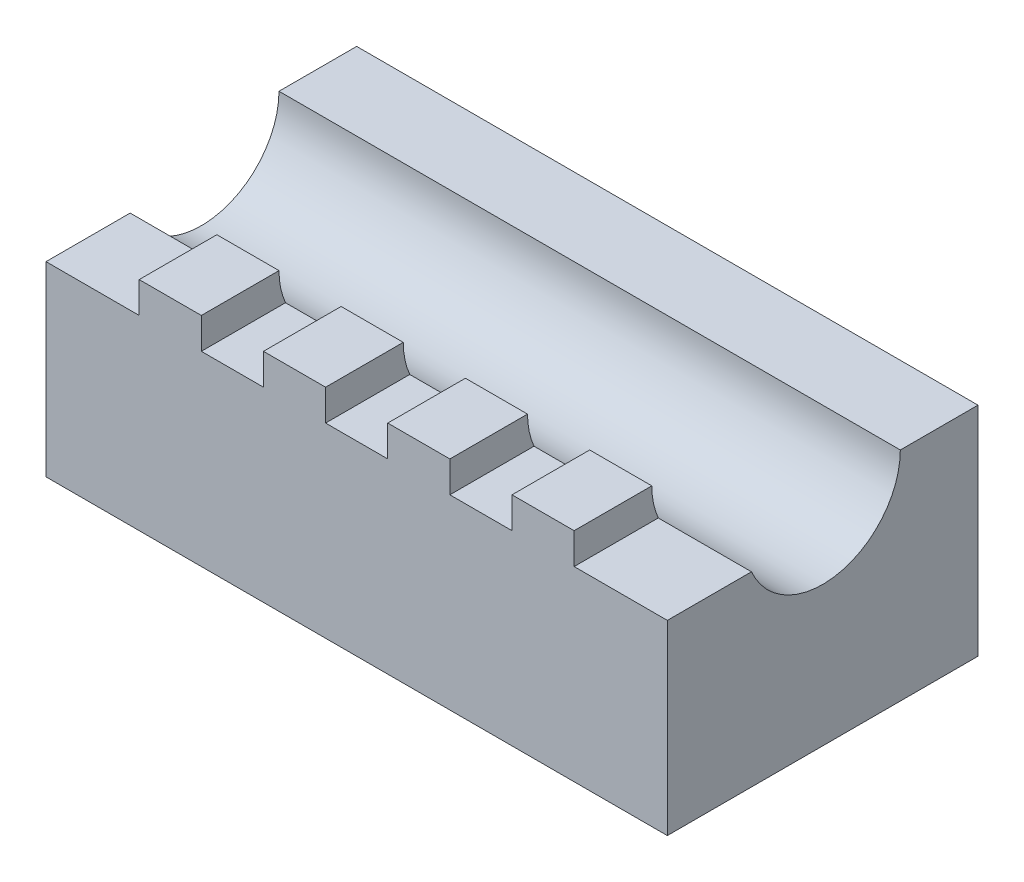
ISO-10303-21;
HEADER;
FILE_DESCRIPTION(('STEP AP214'),'2;1');
FILE_NAME('part.step','',(''),(''),'','','');
FILE_SCHEMA(('AUTOMOTIVE_DESIGN { 1 0 10303 214 1 1 1 1 }'));
ENDSEC;
DATA;
#1=APPLICATION_CONTEXT('core data for automotive mechanical design processes');
#2=APPLICATION_PROTOCOL_DEFINITION('international standard','automotive_design',2000,#1);
#3=PRODUCT_CONTEXT('',#1,'mechanical');
#4=PRODUCT('Part','Part','',(#3));
#5=PRODUCT_RELATED_PRODUCT_CATEGORY('part','',(#4));
#6=PRODUCT_DEFINITION_FORMATION('','',#4);
#7=PRODUCT_DEFINITION_CONTEXT('part definition',#1,'design');
#8=PRODUCT_DEFINITION('design','',#6,#7);
#9=PRODUCT_DEFINITION_SHAPE('','',#8);
#10=(LENGTH_UNIT() NAMED_UNIT(*) SI_UNIT(.MILLI.,.METRE.));
#11=(NAMED_UNIT(*) PLANE_ANGLE_UNIT() SI_UNIT($,.RADIAN.));
#12=(NAMED_UNIT(*) SI_UNIT($,.STERADIAN.) SOLID_ANGLE_UNIT());
#13=UNCERTAINTY_MEASURE_WITH_UNIT(LENGTH_MEASURE(1.E-05),#10,'distance_accuracy_value','');
#14=(GEOMETRIC_REPRESENTATION_CONTEXT(3) GLOBAL_UNCERTAINTY_ASSIGNED_CONTEXT((#13)) GLOBAL_UNIT_ASSIGNED_CONTEXT((#10,
#11,#12)) REPRESENTATION_CONTEXT('',''));
#15=CARTESIAN_POINT('',(0.,0.,0.));
#16=DIRECTION('',(0.,0.,1.));
#17=DIRECTION('',(1.,0.,0.));
#18=AXIS2_PLACEMENT_3D('',#15,#16,#17);
#19=CARTESIAN_POINT('',(0.,35.,50.));
#20=DIRECTION('',(0.,-1.,0.));
#21=DIRECTION('',(0.,0.,-1.));
#22=AXIS2_PLACEMENT_3D('',#19,#20,#21);
#23=PLANE('',#22);
#24=DIRECTION('',(0.,0.,1.));
#25=VECTOR('',#24,1.);
#26=CARTESIAN_POINT('',(15.,35.,25.));
#27=LINE('',#26,#25);
#28=CARTESIAN_POINT('',(15.,35.,37.5));
#29=VERTEX_POINT('',#28);
#30=CARTESIAN_POINT('',(15.,35.,50.));
#31=VERTEX_POINT('',#30);
#32=EDGE_CURVE('E186',#29,#31,#27,.T.);
#33=ORIENTED_EDGE('',*,*,#32,.T.);
#34=DIRECTION('',(-1.,0.,0.));
#35=VECTOR('',#34,1.);
#36=CARTESIAN_POINT('',(0.,35.,50.));
#37=LINE('',#36,#35);
#38=CARTESIAN_POINT('',(25.,35.,50.));
#39=VERTEX_POINT('',#38);
#40=EDGE_CURVE('E198',#39,#31,#37,.T.);
#41=ORIENTED_EDGE('',*,*,#40,.F.);
#42=DIRECTION('',(0.,0.,1.));
#43=VECTOR('',#42,1.);
#44=CARTESIAN_POINT('',(25.,35.,25.));
#45=LINE('',#44,#43);
#46=CARTESIAN_POINT('',(25.,35.,37.5));
#47=VERTEX_POINT('',#46);
#48=EDGE_CURVE('E263',#47,#39,#45,.T.);
#49=ORIENTED_EDGE('',*,*,#48,.F.);
#50=DIRECTION('',(1.,0.,0.));
#51=VECTOR('',#50,1.);
#52=CARTESIAN_POINT('',(0.,35.,37.5));
#53=LINE('',#52,#51);
#54=EDGE_CURVE('E200',#47,#29,#53,.F.);
#55=ORIENTED_EDGE('',*,*,#54,.T.);
#56=EDGE_LOOP('',(#33,#41,#49,#55));
#57=FACE_BOUND('',#56,.T.);
#58=ADVANCED_FACE('F36',(#57),#23,.F.);
#59=DIRECTION('',(0.,0.,1.));
#60=VECTOR('',#59,1.);
#61=CARTESIAN_POINT('',(55.,35.,25.));
#62=LINE('',#61,#60);
#63=CARTESIAN_POINT('',(55.,35.,37.5));
#64=VERTEX_POINT('',#63);
#65=CARTESIAN_POINT('',(55.,35.,50.));
#66=VERTEX_POINT('',#65);
#67=EDGE_CURVE('E241',#64,#66,#62,.T.);
#68=ORIENTED_EDGE('',*,*,#67,.T.);
#69=CARTESIAN_POINT('',(65.,35.,50.));
#70=VERTEX_POINT('',#69);
#71=EDGE_CURVE('E213',#70,#66,#37,.T.);
#72=ORIENTED_EDGE('',*,*,#71,.F.);
#73=DIRECTION('',(0.,0.,1.));
#74=VECTOR('',#73,1.);
#75=CARTESIAN_POINT('',(65.,35.,25.));
#76=LINE('',#75,#74);
#77=CARTESIAN_POINT('',(65.,35.,37.5));
#78=VERTEX_POINT('',#77);
#79=EDGE_CURVE('E239',#78,#70,#76,.T.);
#80=ORIENTED_EDGE('',*,*,#79,.F.);
#81=EDGE_CURVE('E242',#78,#64,#53,.F.);
#82=ORIENTED_EDGE('',*,*,#81,.T.);
#83=EDGE_LOOP('',(#68,#72,#80,#82));
#84=FACE_BOUND('',#83,.T.);
#85=ADVANCED_FACE('F237',(#84),#23,.F.);
#86=CARTESIAN_POINT('',(85.,35.,50.));
#87=VERTEX_POINT('',#86);
#88=CARTESIAN_POINT('',(75.,35.,50.));
#89=VERTEX_POINT('',#88);
#90=EDGE_CURVE('E211',#87,#89,#37,.T.);
#91=ORIENTED_EDGE('',*,*,#90,.F.);
#92=DIRECTION('',(0.,0.,1.));
#93=VECTOR('',#92,1.);
#94=CARTESIAN_POINT('',(85.,35.,25.));
#95=LINE('',#94,#93);
#96=CARTESIAN_POINT('',(85.,35.,37.5));
#97=VERTEX_POINT('',#96);
#98=EDGE_CURVE('E271',#97,#87,#95,.T.);
#99=ORIENTED_EDGE('',*,*,#98,.F.);
#100=CARTESIAN_POINT('',(75.,35.,37.5));
#101=VERTEX_POINT('',#100);
#102=EDGE_CURVE('E357',#97,#101,#53,.F.);
#103=ORIENTED_EDGE('',*,*,#102,.T.);
#104=DIRECTION('',(0.,0.,1.));
#105=VECTOR('',#104,1.);
#106=CARTESIAN_POINT('',(75.,35.,25.));
#107=LINE('',#106,#105);
#108=EDGE_CURVE('E276',#101,#89,#107,.T.);
#109=ORIENTED_EDGE('',*,*,#108,.T.);
#110=EDGE_LOOP('',(#91,#99,#103,#109));
#111=FACE_BOUND('',#110,.T.);
#112=ADVANCED_FACE('F395',(#111),#23,.F.);
#113=CARTESIAN_POINT('',(0.,0.,50.));
#114=DIRECTION('',(0.,0.,-1.));
#115=DIRECTION('',(-1.,0.,0.));
#116=AXIS2_PLACEMENT_3D('',#113,#114,#115);
#117=PLANE('',#116);
#118=DIRECTION('',(0.,-1.,0.));
#119=VECTOR('',#118,1.);
#120=CARTESIAN_POINT('',(15.,0.,50.));
#121=LINE('',#120,#119);
#122=CARTESIAN_POINT('',(15.,30.,50.));
#123=VERTEX_POINT('',#122);
#124=EDGE_CURVE('E183',#31,#123,#121,.T.);
#125=ORIENTED_EDGE('',*,*,#124,.T.);
#126=DIRECTION('',(1.,0.,0.));
#127=VECTOR('',#126,1.);
#128=CARTESIAN_POINT('',(0.,30.,50.));
#129=LINE('',#128,#127);
#130=CARTESIAN_POINT('',(0.,30.,50.));
#131=VERTEX_POINT('',#130);
#132=EDGE_CURVE('E191',#131,#123,#129,.T.);
#133=ORIENTED_EDGE('',*,*,#132,.F.);
#134=DIRECTION('',(0.,-1.,0.));
#135=VECTOR('',#134,1.);
#136=CARTESIAN_POINT('',(0.,0.,50.));
#137=LINE('',#136,#135);
#138=CARTESIAN_POINT('',(0.,0.,50.));
#139=VERTEX_POINT('',#138);
#140=EDGE_CURVE('E288',#131,#139,#137,.T.);
#141=ORIENTED_EDGE('',*,*,#140,.T.);
#142=DIRECTION('',(1.,0.,0.));
#143=VECTOR('',#142,1.);
#144=CARTESIAN_POINT('',(0.,0.,50.));
#145=LINE('',#144,#143);
#146=CARTESIAN_POINT('',(100.,0.,50.));
#147=VERTEX_POINT('',#146);
#148=EDGE_CURVE('E215',#139,#147,#145,.T.);
#149=ORIENTED_EDGE('',*,*,#148,.T.);
#150=DIRECTION('',(0.,1.,0.));
#151=VECTOR('',#150,1.);
#152=CARTESIAN_POINT('',(100.,0.,50.));
#153=LINE('',#152,#151);
#154=CARTESIAN_POINT('',(100.,30.,50.));
#155=VERTEX_POINT('',#154);
#156=EDGE_CURVE('E209',#147,#155,#153,.T.);
#157=ORIENTED_EDGE('',*,*,#156,.T.);
#158=DIRECTION('',(1.,0.,0.));
#159=VECTOR('',#158,1.);
#160=CARTESIAN_POINT('',(0.,30.,50.));
#161=LINE('',#160,#159);
#162=CARTESIAN_POINT('',(85.,30.,50.));
#163=VERTEX_POINT('',#162);
#164=EDGE_CURVE('E318',#163,#155,#161,.T.);
#165=ORIENTED_EDGE('',*,*,#164,.F.);
#166=DIRECTION('',(0.,-1.,0.));
#167=VECTOR('',#166,1.);
#168=CARTESIAN_POINT('',(85.,0.,50.));
#169=LINE('',#168,#167);
#170=EDGE_CURVE('E325',#87,#163,#169,.T.);
#171=ORIENTED_EDGE('',*,*,#170,.F.);
#172=ORIENTED_EDGE('',*,*,#90,.T.);
#173=DIRECTION('',(0.,-1.,0.));
#174=VECTOR('',#173,1.);
#175=CARTESIAN_POINT('',(75.,0.,50.));
#176=LINE('',#175,#174);
#177=CARTESIAN_POINT('',(75.,30.,50.));
#178=VERTEX_POINT('',#177);
#179=EDGE_CURVE('E269',#89,#178,#176,.T.);
#180=ORIENTED_EDGE('',*,*,#179,.T.);
#181=DIRECTION('',(1.,0.,0.));
#182=VECTOR('',#181,1.);
#183=CARTESIAN_POINT('',(0.,30.,50.));
#184=LINE('',#183,#182);
#185=CARTESIAN_POINT('',(65.,30.,50.));
#186=VERTEX_POINT('',#185);
#187=EDGE_CURVE('E273',#186,#178,#184,.T.);
#188=ORIENTED_EDGE('',*,*,#187,.F.);
#189=DIRECTION('',(0.,-1.,0.));
#190=VECTOR('',#189,1.);
#191=CARTESIAN_POINT('',(65.,0.,50.));
#192=LINE('',#191,#190);
#193=EDGE_CURVE('E233',#70,#186,#192,.T.);
#194=ORIENTED_EDGE('',*,*,#193,.F.);
#195=ORIENTED_EDGE('',*,*,#71,.T.);
#196=DIRECTION('',(0.,-1.,0.));
#197=VECTOR('',#196,1.);
#198=CARTESIAN_POINT('',(55.,0.,50.));
#199=LINE('',#198,#197);
#200=CARTESIAN_POINT('',(55.,30.,50.));
#201=VERTEX_POINT('',#200);
#202=EDGE_CURVE('E230',#66,#201,#199,.T.);
#203=ORIENTED_EDGE('',*,*,#202,.T.);
#204=DIRECTION('',(1.,0.,0.));
#205=VECTOR('',#204,1.);
#206=CARTESIAN_POINT('',(0.,30.,50.));
#207=LINE('',#206,#205);
#208=CARTESIAN_POINT('',(45.,30.,50.));
#209=VERTEX_POINT('',#208);
#210=EDGE_CURVE('E246',#209,#201,#207,.T.);
#211=ORIENTED_EDGE('',*,*,#210,.F.);
#212=DIRECTION('',(0.,-1.,0.));
#213=VECTOR('',#212,1.);
#214=CARTESIAN_POINT('',(45.,0.,50.));
#215=LINE('',#214,#213);
#216=CARTESIAN_POINT('',(45.,35.,50.));
#217=VERTEX_POINT('',#216);
#218=EDGE_CURVE('E250',#217,#209,#215,.T.);
#219=ORIENTED_EDGE('',*,*,#218,.F.);
#220=CARTESIAN_POINT('',(35.,35.,50.));
#221=VERTEX_POINT('',#220);
#222=EDGE_CURVE('E208',#217,#221,#37,.T.);
#223=ORIENTED_EDGE('',*,*,#222,.T.);
#224=DIRECTION('',(0.,1.,0.));
#225=VECTOR('',#224,1.);
#226=CARTESIAN_POINT('',(35.,0.,50.));
#227=LINE('',#226,#225);
#228=CARTESIAN_POINT('',(35.,30.,50.));
#229=VERTEX_POINT('',#228);
#230=EDGE_CURVE('E257',#229,#221,#227,.T.);
#231=ORIENTED_EDGE('',*,*,#230,.F.);
#232=DIRECTION('',(1.,0.,0.));
#233=VECTOR('',#232,1.);
#234=CARTESIAN_POINT('',(0.,30.,50.));
#235=LINE('',#234,#233);
#236=CARTESIAN_POINT('',(25.,30.,50.));
#237=VERTEX_POINT('',#236);
#238=EDGE_CURVE('E254',#237,#229,#235,.T.);
#239=ORIENTED_EDGE('',*,*,#238,.F.);
#240=DIRECTION('',(0.,-1.,0.));
#241=VECTOR('',#240,1.);
#242=CARTESIAN_POINT('',(24.9999999999999,0.,50.));
#243=LINE('',#242,#241);
#244=EDGE_CURVE('E207',#39,#237,#243,.T.);
#245=ORIENTED_EDGE('',*,*,#244,.F.);
#246=ORIENTED_EDGE('',*,*,#40,.T.);
#247=EDGE_LOOP('',(#125,#133,#141,#149,#157,#165,#171,#172,#180,#188,#194,#195,#203,#211,#219,
#223,#231,#239,#245,#246));
#248=FACE_BOUND('',#247,.T.);
#249=ADVANCED_FACE('F204',(#248),#117,.F.);
#250=CARTESIAN_POINT('',(0.,34.9999999999999,25.));
#251=DIRECTION('',(1.,0.,0.));
#252=DIRECTION('',(0.,1.,0.));
#253=AXIS2_PLACEMENT_3D('',#250,#251,#252);
#254=CYLINDRICAL_SURFACE('',#253,12.5);
#255=CARTESIAN_POINT('',(15.,35.,25.));
#256=DIRECTION('',(-1.,0.,0.));
#257=DIRECTION('',(0.,-1.,0.));
#258=AXIS2_PLACEMENT_3D('',#255,#256,#257);
#259=CIRCLE('',#258,12.5);
#260=CARTESIAN_POINT('',(15.,30.,36.4564392373896));
#261=VERTEX_POINT('',#260);
#262=EDGE_CURVE('E11',#29,#261,#259,.F.);
#263=ORIENTED_EDGE('',*,*,#262,.F.);
#264=ORIENTED_EDGE('',*,*,#54,.F.);
#265=CARTESIAN_POINT('',(25.,35.,25.));
#266=DIRECTION('',(-1.,0.,0.));
#267=DIRECTION('',(0.,-1.,0.));
#268=AXIS2_PLACEMENT_3D('',#265,#266,#267);
#269=CIRCLE('',#268,12.5);
#270=CARTESIAN_POINT('',(25.,30.,36.4564392373896));
#271=VERTEX_POINT('',#270);
#272=EDGE_CURVE('E354',#47,#271,#269,.F.);
#273=ORIENTED_EDGE('',*,*,#272,.T.);
#274=DIRECTION('',(1.,0.,0.));
#275=VECTOR('',#274,1.);
#276=CARTESIAN_POINT('',(0.,30.,36.4564392373896));
#277=LINE('',#276,#275);
#278=CARTESIAN_POINT('',(35.,30.,36.4564392373896));
#279=VERTEX_POINT('',#278);
#280=EDGE_CURVE('E351',#271,#279,#277,.T.);
#281=ORIENTED_EDGE('',*,*,#280,.T.);
#282=CARTESIAN_POINT('',(35.,35.,25.));
#283=DIRECTION('',(1.,0.,0.));
#284=DIRECTION('',(0.,0.,-1.));
#285=AXIS2_PLACEMENT_3D('',#282,#283,#284);
#286=CIRCLE('',#285,12.5);
#287=CARTESIAN_POINT('',(35.,35.,37.5));
#288=VERTEX_POINT('',#287);
#289=EDGE_CURVE('E345',#279,#288,#286,.F.);
#290=ORIENTED_EDGE('',*,*,#289,.T.);
#291=CARTESIAN_POINT('',(45.,35.,37.5));
#292=VERTEX_POINT('',#291);
#293=EDGE_CURVE('E341',#292,#288,#53,.F.);
#294=ORIENTED_EDGE('',*,*,#293,.F.);
#295=CARTESIAN_POINT('',(45.,35.,25.));
#296=DIRECTION('',(-1.,0.,0.));
#297=DIRECTION('',(0.,0.,1.));
#298=AXIS2_PLACEMENT_3D('',#295,#296,#297);
#299=CIRCLE('',#298,12.5);
#300=CARTESIAN_POINT('',(45.,30.,36.4564392373896));
#301=VERTEX_POINT('',#300);
#302=EDGE_CURVE('E375',#292,#301,#299,.F.);
#303=ORIENTED_EDGE('',*,*,#302,.T.);
#304=DIRECTION('',(1.,0.,0.));
#305=VECTOR('',#304,1.);
#306=CARTESIAN_POINT('',(0.,30.,36.4564392373896));
#307=LINE('',#306,#305);
#308=CARTESIAN_POINT('',(55.,30.,36.4564392373896));
#309=VERTEX_POINT('',#308);
#310=EDGE_CURVE('E330',#301,#309,#307,.T.);
#311=ORIENTED_EDGE('',*,*,#310,.T.);
#312=CARTESIAN_POINT('',(55.,35.,25.));
#313=DIRECTION('',(-1.,0.,0.));
#314=DIRECTION('',(0.,0.,1.));
#315=AXIS2_PLACEMENT_3D('',#312,#313,#314);
#316=CIRCLE('',#315,12.5);
#317=EDGE_CURVE('E378',#64,#309,#316,.F.);
#318=ORIENTED_EDGE('',*,*,#317,.F.);
#319=ORIENTED_EDGE('',*,*,#81,.F.);
#320=CARTESIAN_POINT('',(65.,35.,25.));
#321=DIRECTION('',(-1.,0.,0.));
#322=DIRECTION('',(0.,0.,1.));
#323=AXIS2_PLACEMENT_3D('',#320,#321,#322);
#324=CIRCLE('',#323,12.5);
#325=CARTESIAN_POINT('',(65.,30.,36.4564392373896));
#326=VERTEX_POINT('',#325);
#327=EDGE_CURVE('E362',#78,#326,#324,.F.);
#328=ORIENTED_EDGE('',*,*,#327,.T.);
#329=DIRECTION('',(1.,0.,0.));
#330=VECTOR('',#329,1.);
#331=CARTESIAN_POINT('',(0.,30.,36.4564392373896));
#332=LINE('',#331,#330);
#333=CARTESIAN_POINT('',(75.,30.,36.4564392373896));
#334=VERTEX_POINT('',#333);
#335=EDGE_CURVE('E365',#326,#334,#332,.T.);
#336=ORIENTED_EDGE('',*,*,#335,.T.);
#337=CARTESIAN_POINT('',(75.,35.,25.));
#338=DIRECTION('',(-1.,0.,0.));
#339=DIRECTION('',(0.,0.,1.));
#340=AXIS2_PLACEMENT_3D('',#337,#338,#339);
#341=CIRCLE('',#340,12.5);
#342=EDGE_CURVE('E368',#101,#334,#341,.F.);
#343=ORIENTED_EDGE('',*,*,#342,.F.);
#344=ORIENTED_EDGE('',*,*,#102,.F.);
#345=CARTESIAN_POINT('',(85.,35.,25.));
#346=DIRECTION('',(-1.,0.,0.));
#347=DIRECTION('',(0.,0.,1.));
#348=AXIS2_PLACEMENT_3D('',#345,#346,#347);
#349=CIRCLE('',#348,12.5);
#350=CARTESIAN_POINT('',(85.,30.,36.4564392373896));
#351=VERTEX_POINT('',#350);
#352=EDGE_CURVE('E372',#97,#351,#349,.F.);
#353=ORIENTED_EDGE('',*,*,#352,.T.);
#354=DIRECTION('',(1.,0.,0.));
#355=VECTOR('',#354,1.);
#356=CARTESIAN_POINT('',(0.,30.,36.4564392373896));
#357=LINE('',#356,#355);
#358=CARTESIAN_POINT('',(100.,30.,36.4564392373896));
#359=VERTEX_POINT('',#358);
#360=EDGE_CURVE('E370',#351,#359,#357,.T.);
#361=ORIENTED_EDGE('',*,*,#360,.T.);
#362=CARTESIAN_POINT('',(100.,35.,25.));
#363=DIRECTION('',(1.,0.,0.));
#364=DIRECTION('',(0.,1.,0.));
#365=AXIS2_PLACEMENT_3D('',#362,#363,#364);
#366=CIRCLE('',#365,12.5);
#367=CARTESIAN_POINT('',(100.,35.,12.5));
#368=VERTEX_POINT('',#367);
#369=EDGE_CURVE('E286',#359,#368,#366,.T.);
#370=ORIENTED_EDGE('',*,*,#369,.T.);
#371=DIRECTION('',(1.,0.,0.));
#372=VECTOR('',#371,1.);
#373=CARTESIAN_POINT('',(0.,35.,12.5));
#374=LINE('',#373,#372);
#375=CARTESIAN_POINT('',(0.,35.,12.5));
#376=VERTEX_POINT('',#375);
#377=EDGE_CURVE('E352',#376,#368,#374,.T.);
#378=ORIENTED_EDGE('',*,*,#377,.F.);
#379=CARTESIAN_POINT('',(0.,34.9999999999999,25.));
#380=DIRECTION('',(1.,0.,0.));
#381=DIRECTION('',(0.,1.,0.));
#382=AXIS2_PLACEMENT_3D('',#379,#380,#381);
#383=CIRCLE('',#382,12.5);
#384=CARTESIAN_POINT('',(0.,30.,36.4564392373896));
#385=VERTEX_POINT('',#384);
#386=EDGE_CURVE('E283',#385,#376,#383,.T.);
#387=ORIENTED_EDGE('',*,*,#386,.F.);
#388=DIRECTION('',(1.,0.,0.));
#389=VECTOR('',#388,1.);
#390=CARTESIAN_POINT('',(0.,30.,36.4564392373896));
#391=LINE('',#390,#389);
#392=EDGE_CURVE('E44',#385,#261,#391,.T.);
#393=ORIENTED_EDGE('',*,*,#392,.T.);
#394=EDGE_LOOP('',(#263,#264,#273,#281,#290,#294,#303,#311,#318,#319,#328,#336,#343,#344,#353,
#361,#370,#378,#387,#393));
#395=FACE_BOUND('',#394,.T.);
#396=ADVANCED_FACE('F349',(#395),#254,.F.);
#397=DIRECTION('',(0.,0.,-1.));
#398=VECTOR('',#397,1.);
#399=CARTESIAN_POINT('',(0.,35.,50.));
#400=LINE('',#399,#398);
#401=CARTESIAN_POINT('',(0.,35.,0.));
#402=VERTEX_POINT('',#401);
#403=EDGE_CURVE('E219',#376,#402,#400,.T.);
#404=ORIENTED_EDGE('',*,*,#403,.F.);
#405=ORIENTED_EDGE('',*,*,#377,.T.);
#406=DIRECTION('',(0.,0.,-1.));
#407=VECTOR('',#406,1.);
#408=CARTESIAN_POINT('',(100.,35.,50.));
#409=LINE('',#408,#407);
#410=CARTESIAN_POINT('',(100.,35.,0.));
#411=VERTEX_POINT('',#410);
#412=EDGE_CURVE('E223',#368,#411,#409,.T.);
#413=ORIENTED_EDGE('',*,*,#412,.T.);
#414=DIRECTION('',(-1.,0.,0.));
#415=VECTOR('',#414,1.);
#416=CARTESIAN_POINT('',(0.,35.,0.));
#417=LINE('',#416,#415);
#418=EDGE_CURVE('E290',#411,#402,#417,.T.);
#419=ORIENTED_EDGE('',*,*,#418,.T.);
#420=EDGE_LOOP('',(#404,#405,#413,#419));
#421=FACE_BOUND('',#420,.T.);
#422=ADVANCED_FACE('F426',(#421),#23,.F.);
#423=CARTESIAN_POINT('',(0.,0.,50.));
#424=DIRECTION('',(1.,0.,0.));
#425=DIRECTION('',(0.,1.,0.));
#426=AXIS2_PLACEMENT_3D('',#423,#424,#425);
#427=PLANE('',#426);
#428=ORIENTED_EDGE('',*,*,#140,.F.);
#429=DIRECTION('',(0.,0.,1.));
#430=VECTOR('',#429,1.);
#431=CARTESIAN_POINT('',(0.,30.,25.));
#432=LINE('',#431,#430);
#433=EDGE_CURVE('E201',#385,#131,#432,.T.);
#434=ORIENTED_EDGE('',*,*,#433,.F.);
#435=ORIENTED_EDGE('',*,*,#386,.T.);
#436=ORIENTED_EDGE('',*,*,#403,.T.);
#437=DIRECTION('',(0.,-1.,0.));
#438=VECTOR('',#437,1.);
#439=CARTESIAN_POINT('',(0.,0.,0.));
#440=LINE('',#439,#438);
#441=CARTESIAN_POINT('',(0.,0.,0.));
#442=VERTEX_POINT('',#441);
#443=EDGE_CURVE('E285',#402,#442,#440,.T.);
#444=ORIENTED_EDGE('',*,*,#443,.T.);
#445=DIRECTION('',(0.,0.,-1.));
#446=VECTOR('',#445,1.);
#447=CARTESIAN_POINT('',(0.,0.,50.));
#448=LINE('',#447,#446);
#449=EDGE_CURVE('E306',#139,#442,#448,.T.);
#450=ORIENTED_EDGE('',*,*,#449,.F.);
#451=EDGE_LOOP('',(#428,#434,#435,#436,#444,#450));
#452=FACE_BOUND('',#451,.T.);
#453=ADVANCED_FACE('F38',(#452),#427,.F.);
#454=CARTESIAN_POINT('',(0.,0.,50.));
#455=DIRECTION('',(0.,1.,0.));
#456=DIRECTION('',(0.,0.,1.));
#457=AXIS2_PLACEMENT_3D('',#454,#455,#456);
#458=PLANE('',#457);
#459=DIRECTION('',(1.,0.,0.));
#460=VECTOR('',#459,1.);
#461=CARTESIAN_POINT('',(0.,0.,0.));
#462=LINE('',#461,#460);
#463=CARTESIAN_POINT('',(100.,0.,0.));
#464=VERTEX_POINT('',#463);
#465=EDGE_CURVE('E302',#442,#464,#462,.T.);
#466=ORIENTED_EDGE('',*,*,#465,.T.);
#467=DIRECTION('',(0.,0.,-1.));
#468=VECTOR('',#467,1.);
#469=CARTESIAN_POINT('',(100.,0.,50.));
#470=LINE('',#469,#468);
#471=EDGE_CURVE('E300',#147,#464,#470,.T.);
#472=ORIENTED_EDGE('',*,*,#471,.F.);
#473=ORIENTED_EDGE('',*,*,#148,.F.);
#474=ORIENTED_EDGE('',*,*,#449,.T.);
#475=EDGE_LOOP('',(#466,#472,#473,#474));
#476=FACE_BOUND('',#475,.T.);
#477=ADVANCED_FACE('F301',(#476),#458,.F.);
#478=CARTESIAN_POINT('',(100.,0.,50.));
#479=DIRECTION('',(-1.,0.,0.));
#480=DIRECTION('',(0.,0.,1.));
#481=AXIS2_PLACEMENT_3D('',#478,#479,#480);
#482=PLANE('',#481);
#483=ORIENTED_EDGE('',*,*,#369,.F.);
#484=DIRECTION('',(0.,0.,1.));
#485=VECTOR('',#484,1.);
#486=CARTESIAN_POINT('',(100.,30.,25.));
#487=LINE('',#486,#485);
#488=EDGE_CURVE('E311',#359,#155,#487,.T.);
#489=ORIENTED_EDGE('',*,*,#488,.T.);
#490=ORIENTED_EDGE('',*,*,#156,.F.);
#491=ORIENTED_EDGE('',*,*,#471,.T.);
#492=DIRECTION('',(0.,1.,0.));
#493=VECTOR('',#492,1.);
#494=CARTESIAN_POINT('',(100.,0.,0.));
#495=LINE('',#494,#493);
#496=EDGE_CURVE('E471',#464,#411,#495,.T.);
#497=ORIENTED_EDGE('',*,*,#496,.T.);
#498=ORIENTED_EDGE('',*,*,#412,.F.);
#499=EDGE_LOOP('',(#483,#489,#490,#491,#497,#498));
#500=FACE_BOUND('',#499,.T.);
#501=ADVANCED_FACE('F310',(#500),#482,.F.);
#502=ORIENTED_EDGE('',*,*,#222,.F.);
#503=DIRECTION('',(0.,0.,1.));
#504=VECTOR('',#503,1.);
#505=CARTESIAN_POINT('',(45.,35.,25.));
#506=LINE('',#505,#504);
#507=EDGE_CURVE('E245',#292,#217,#506,.T.);
#508=ORIENTED_EDGE('',*,*,#507,.F.);
#509=ORIENTED_EDGE('',*,*,#293,.T.);
#510=DIRECTION('',(0.,0.,1.));
#511=VECTOR('',#510,1.);
#512=CARTESIAN_POINT('',(35.,35.,25.));
#513=LINE('',#512,#511);
#514=EDGE_CURVE('E265',#288,#221,#513,.T.);
#515=ORIENTED_EDGE('',*,*,#514,.T.);
#516=EDGE_LOOP('',(#502,#508,#509,#515));
#517=FACE_BOUND('',#516,.T.);
#518=ADVANCED_FACE('F338',(#517),#23,.F.);
#519=CARTESIAN_POINT('',(0.,0.,0.));
#520=DIRECTION('',(0.,0.,-1.));
#521=DIRECTION('',(-1.,0.,0.));
#522=AXIS2_PLACEMENT_3D('',#519,#520,#521);
#523=PLANE('',#522);
#524=ORIENTED_EDGE('',*,*,#443,.F.);
#525=ORIENTED_EDGE('',*,*,#418,.F.);
#526=ORIENTED_EDGE('',*,*,#496,.F.);
#527=ORIENTED_EDGE('',*,*,#465,.F.);
#528=EDGE_LOOP('',(#524,#525,#526,#527));
#529=FACE_BOUND('',#528,.T.);
#530=ADVANCED_FACE('F425',(#529),#523,.T.);
#531=CARTESIAN_POINT('',(0.,30.,25.));
#532=DIRECTION('',(0.,-1.,0.));
#533=DIRECTION('',(0.,0.,-1.));
#534=AXIS2_PLACEMENT_3D('',#531,#532,#533);
#535=PLANE('',#534);
#536=DIRECTION('',(0.,0.,1.));
#537=VECTOR('',#536,1.);
#538=CARTESIAN_POINT('',(25.,30.,25.));
#539=LINE('',#538,#537);
#540=EDGE_CURVE('E192',#271,#237,#539,.T.);
#541=ORIENTED_EDGE('',*,*,#540,.T.);
#542=ORIENTED_EDGE('',*,*,#238,.T.);
#543=DIRECTION('',(0.,0.,1.));
#544=VECTOR('',#543,1.);
#545=CARTESIAN_POINT('',(35.,30.,25.));
#546=LINE('',#545,#544);
#547=EDGE_CURVE('E261',#279,#229,#546,.T.);
#548=ORIENTED_EDGE('',*,*,#547,.F.);
#549=ORIENTED_EDGE('',*,*,#280,.F.);
#550=EDGE_LOOP('',(#541,#542,#548,#549));
#551=FACE_BOUND('',#550,.T.);
#552=ADVANCED_FACE('F431',(#551),#535,.F.);
#553=CARTESIAN_POINT('',(24.9999999999999,0.,25.));
#554=DIRECTION('',(-1.,0.,0.));
#555=DIRECTION('',(0.,-1.,0.));
#556=AXIS2_PLACEMENT_3D('',#553,#554,#555);
#557=PLANE('',#556);
#558=ORIENTED_EDGE('',*,*,#48,.T.);
#559=ORIENTED_EDGE('',*,*,#244,.T.);
#560=ORIENTED_EDGE('',*,*,#540,.F.);
#561=ORIENTED_EDGE('',*,*,#272,.F.);
#562=EDGE_LOOP('',(#558,#559,#560,#561));
#563=FACE_BOUND('',#562,.T.);
#564=ADVANCED_FACE('F452',(#563),#557,.F.);
#565=CARTESIAN_POINT('',(35.,0.,25.));
#566=DIRECTION('',(1.,0.,0.));
#567=DIRECTION('',(0.,0.,-1.));
#568=AXIS2_PLACEMENT_3D('',#565,#566,#567);
#569=PLANE('',#568);
#570=ORIENTED_EDGE('',*,*,#547,.T.);
#571=ORIENTED_EDGE('',*,*,#230,.T.);
#572=ORIENTED_EDGE('',*,*,#514,.F.);
#573=ORIENTED_EDGE('',*,*,#289,.F.);
#574=EDGE_LOOP('',(#570,#571,#572,#573));
#575=FACE_BOUND('',#574,.T.);
#576=ADVANCED_FACE('F344',(#575),#569,.F.);
#577=CARTESIAN_POINT('',(75.,0.,25.));
#578=DIRECTION('',(-1.,0.,0.));
#579=DIRECTION('',(0.,0.,1.));
#580=AXIS2_PLACEMENT_3D('',#577,#578,#579);
#581=PLANE('',#580);
#582=ORIENTED_EDGE('',*,*,#342,.T.);
#583=DIRECTION('',(0.,0.,1.));
#584=VECTOR('',#583,1.);
#585=CARTESIAN_POINT('',(75.,30.,25.));
#586=LINE('',#585,#584);
#587=EDGE_CURVE('E258',#334,#178,#586,.T.);
#588=ORIENTED_EDGE('',*,*,#587,.T.);
#589=ORIENTED_EDGE('',*,*,#179,.F.);
#590=ORIENTED_EDGE('',*,*,#108,.F.);
#591=EDGE_LOOP('',(#582,#588,#589,#590));
#592=FACE_BOUND('',#591,.T.);
#593=ADVANCED_FACE('F400',(#592),#581,.T.);
#594=CARTESIAN_POINT('',(0.,30.,25.));
#595=DIRECTION('',(0.,-1.,0.));
#596=DIRECTION('',(0.,0.,-1.));
#597=AXIS2_PLACEMENT_3D('',#594,#595,#596);
#598=PLANE('',#597);
#599=DIRECTION('',(0.,0.,1.));
#600=VECTOR('',#599,1.);
#601=CARTESIAN_POINT('',(65.,30.,25.));
#602=LINE('',#601,#600);
#603=EDGE_CURVE('E278',#326,#186,#602,.T.);
#604=ORIENTED_EDGE('',*,*,#603,.T.);
#605=ORIENTED_EDGE('',*,*,#187,.T.);
#606=ORIENTED_EDGE('',*,*,#587,.F.);
#607=ORIENTED_EDGE('',*,*,#335,.F.);
#608=EDGE_LOOP('',(#604,#605,#606,#607));
#609=FACE_BOUND('',#608,.T.);
#610=ADVANCED_FACE('F404',(#609),#598,.F.);
#611=CARTESIAN_POINT('',(65.,0.,25.));
#612=DIRECTION('',(-1.,0.,0.));
#613=DIRECTION('',(0.,0.,1.));
#614=AXIS2_PLACEMENT_3D('',#611,#612,#613);
#615=PLANE('',#614);
#616=ORIENTED_EDGE('',*,*,#79,.T.);
#617=ORIENTED_EDGE('',*,*,#193,.T.);
#618=ORIENTED_EDGE('',*,*,#603,.F.);
#619=ORIENTED_EDGE('',*,*,#327,.F.);
#620=EDGE_LOOP('',(#616,#617,#618,#619));
#621=FACE_BOUND('',#620,.T.);
#622=ADVANCED_FACE('F406',(#621),#615,.F.);
#623=CARTESIAN_POINT('',(85.,0.,25.));
#624=DIRECTION('',(-1.,0.,0.));
#625=DIRECTION('',(0.,0.,1.));
#626=AXIS2_PLACEMENT_3D('',#623,#624,#625);
#627=PLANE('',#626);
#628=ORIENTED_EDGE('',*,*,#98,.T.);
#629=ORIENTED_EDGE('',*,*,#170,.T.);
#630=DIRECTION('',(0.,0.,1.));
#631=VECTOR('',#630,1.);
#632=CARTESIAN_POINT('',(85.,30.,25.));
#633=LINE('',#632,#631);
#634=EDGE_CURVE('E315',#351,#163,#633,.T.);
#635=ORIENTED_EDGE('',*,*,#634,.F.);
#636=ORIENTED_EDGE('',*,*,#352,.F.);
#637=EDGE_LOOP('',(#628,#629,#635,#636));
#638=FACE_BOUND('',#637,.T.);
#639=ADVANCED_FACE('F408',(#638),#627,.F.);
#640=CARTESIAN_POINT('',(0.,30.,25.));
#641=DIRECTION('',(0.,-1.,0.));
#642=DIRECTION('',(0.,0.,-1.));
#643=AXIS2_PLACEMENT_3D('',#640,#641,#642);
#644=PLANE('',#643);
#645=ORIENTED_EDGE('',*,*,#634,.T.);
#646=ORIENTED_EDGE('',*,*,#164,.T.);
#647=ORIENTED_EDGE('',*,*,#488,.F.);
#648=ORIENTED_EDGE('',*,*,#360,.F.);
#649=EDGE_LOOP('',(#645,#646,#647,#648));
#650=FACE_BOUND('',#649,.T.);
#651=ADVANCED_FACE('F390',(#650),#644,.F.);
#652=CARTESIAN_POINT('',(55.,0.,25.));
#653=DIRECTION('',(-1.,0.,0.));
#654=DIRECTION('',(0.,0.,1.));
#655=AXIS2_PLACEMENT_3D('',#652,#653,#654);
#656=PLANE('',#655);
#657=ORIENTED_EDGE('',*,*,#317,.T.);
#658=DIRECTION('',(0.,0.,1.));
#659=VECTOR('',#658,1.);
#660=CARTESIAN_POINT('',(55.,30.,25.));
#661=LINE('',#660,#659);
#662=EDGE_CURVE('E324',#309,#201,#661,.T.);
#663=ORIENTED_EDGE('',*,*,#662,.T.);
#664=ORIENTED_EDGE('',*,*,#202,.F.);
#665=ORIENTED_EDGE('',*,*,#67,.F.);
#666=EDGE_LOOP('',(#657,#663,#664,#665));
#667=FACE_BOUND('',#666,.T.);
#668=ADVANCED_FACE('F515',(#667),#656,.T.);
#669=CARTESIAN_POINT('',(0.,30.,25.));
#670=DIRECTION('',(0.,-1.,0.));
#671=DIRECTION('',(0.,0.,-1.));
#672=AXIS2_PLACEMENT_3D('',#669,#670,#671);
#673=PLANE('',#672);
#674=DIRECTION('',(0.,0.,1.));
#675=VECTOR('',#674,1.);
#676=CARTESIAN_POINT('',(45.,30.,25.));
#677=LINE('',#676,#675);
#678=EDGE_CURVE('E58',#301,#209,#677,.T.);
#679=ORIENTED_EDGE('',*,*,#678,.T.);
#680=ORIENTED_EDGE('',*,*,#210,.T.);
#681=ORIENTED_EDGE('',*,*,#662,.F.);
#682=ORIENTED_EDGE('',*,*,#310,.F.);
#683=EDGE_LOOP('',(#679,#680,#681,#682));
#684=FACE_BOUND('',#683,.T.);
#685=ADVANCED_FACE('F327',(#684),#673,.F.);
#686=CARTESIAN_POINT('',(45.,0.,25.));
#687=DIRECTION('',(-1.,0.,0.));
#688=DIRECTION('',(0.,0.,1.));
#689=AXIS2_PLACEMENT_3D('',#686,#687,#688);
#690=PLANE('',#689);
#691=ORIENTED_EDGE('',*,*,#507,.T.);
#692=ORIENTED_EDGE('',*,*,#218,.T.);
#693=ORIENTED_EDGE('',*,*,#678,.F.);
#694=ORIENTED_EDGE('',*,*,#302,.F.);
#695=EDGE_LOOP('',(#691,#692,#693,#694));
#696=FACE_BOUND('',#695,.T.);
#697=ADVANCED_FACE('F333',(#696),#690,.F.);
#698=CARTESIAN_POINT('',(15.,0.,25.));
#699=DIRECTION('',(-1.,0.,0.));
#700=DIRECTION('',(0.,-1.,0.));
#701=AXIS2_PLACEMENT_3D('',#698,#699,#700);
#702=PLANE('',#701);
#703=ORIENTED_EDGE('',*,*,#262,.T.);
#704=DIRECTION('',(0.,0.,1.));
#705=VECTOR('',#704,1.);
#706=CARTESIAN_POINT('',(15.,30.,25.));
#707=LINE('',#706,#705);
#708=EDGE_CURVE('E51',#261,#123,#707,.T.);
#709=ORIENTED_EDGE('',*,*,#708,.T.);
#710=ORIENTED_EDGE('',*,*,#124,.F.);
#711=ORIENTED_EDGE('',*,*,#32,.F.);
#712=EDGE_LOOP('',(#703,#709,#710,#711));
#713=FACE_BOUND('',#712,.T.);
#714=ADVANCED_FACE('F185',(#713),#702,.T.);
#715=CARTESIAN_POINT('',(0.,30.,25.));
#716=DIRECTION('',(0.,-1.,0.));
#717=DIRECTION('',(0.,0.,-1.));
#718=AXIS2_PLACEMENT_3D('',#715,#716,#717);
#719=PLANE('',#718);
#720=ORIENTED_EDGE('',*,*,#433,.T.);
#721=ORIENTED_EDGE('',*,*,#132,.T.);
#722=ORIENTED_EDGE('',*,*,#708,.F.);
#723=ORIENTED_EDGE('',*,*,#392,.F.);
#724=EDGE_LOOP('',(#720,#721,#722,#723));
#725=FACE_BOUND('',#724,.T.);
#726=ADVANCED_FACE('F383',(#725),#719,.F.);
#727=CLOSED_SHELL('',(#58,#85,#112,#249,#396,#422,#453,#477,#501,#518,#530,#552,#564,#576,#593,
#610,#622,#639,#651,#668,#685,#697,#714,#726));
#728=MANIFOLD_SOLID_BREP('B2',#727);
#729=ADVANCED_BREP_SHAPE_REPRESENTATION('',(#18,#728),#14);
#730=SHAPE_DEFINITION_REPRESENTATION(#9,#729);
ENDSEC;
END-ISO-10303-21;
